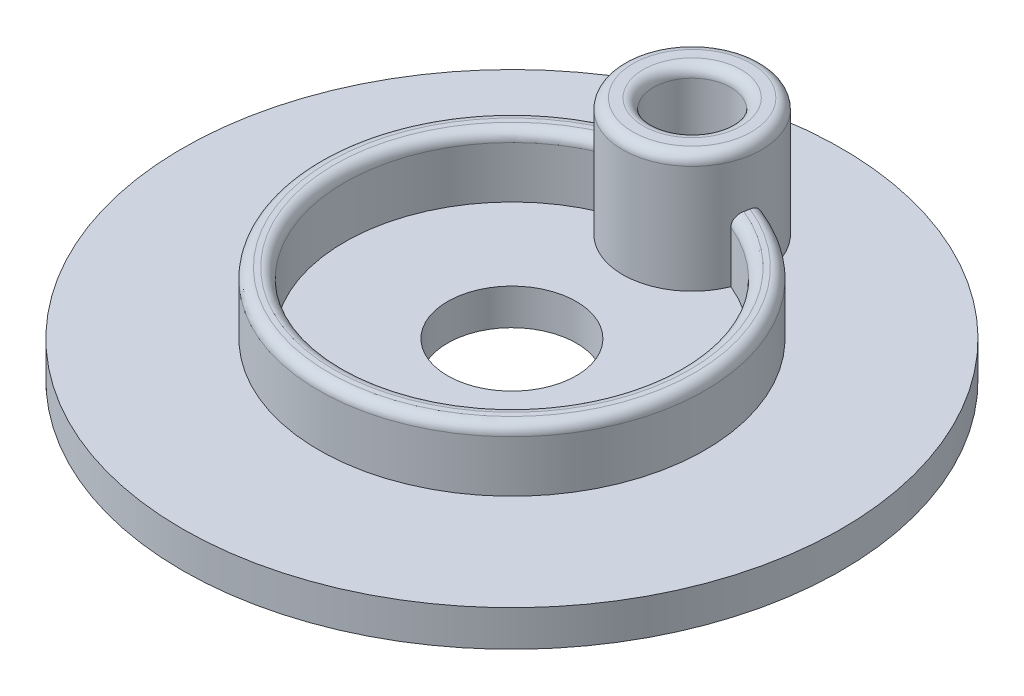
ISO-10303-21;
HEADER;
FILE_DESCRIPTION(('STEP AP214'),'2;1');
FILE_NAME('part.step','',(''),(''),'','','');
FILE_SCHEMA(('AUTOMOTIVE_DESIGN { 1 0 10303 214 1 1 1 1 }'));
ENDSEC;
DATA;
#1=APPLICATION_CONTEXT('core data for automotive mechanical design processes');
#2=APPLICATION_PROTOCOL_DEFINITION('international standard','automotive_design',2000,#1);
#3=PRODUCT_CONTEXT('',#1,'mechanical');
#4=PRODUCT('Part','Part','',(#3));
#5=PRODUCT_RELATED_PRODUCT_CATEGORY('part','',(#4));
#6=PRODUCT_DEFINITION_FORMATION('','',#4);
#7=PRODUCT_DEFINITION_CONTEXT('part definition',#1,'design');
#8=PRODUCT_DEFINITION('design','',#6,#7);
#9=PRODUCT_DEFINITION_SHAPE('','',#8);
#10=(LENGTH_UNIT() NAMED_UNIT(*) SI_UNIT(.MILLI.,.METRE.));
#11=(NAMED_UNIT(*) PLANE_ANGLE_UNIT() SI_UNIT($,.RADIAN.));
#12=(NAMED_UNIT(*) SI_UNIT($,.STERADIAN.) SOLID_ANGLE_UNIT());
#13=UNCERTAINTY_MEASURE_WITH_UNIT(LENGTH_MEASURE(1.E-05),#10,'distance_accuracy_value','');
#14=(GEOMETRIC_REPRESENTATION_CONTEXT(3) GLOBAL_UNCERTAINTY_ASSIGNED_CONTEXT((#13)) GLOBAL_UNIT_ASSIGNED_CONTEXT((#10,
#11,#12)) REPRESENTATION_CONTEXT('',''));
#15=CARTESIAN_POINT('',(0.,0.,0.));
#16=DIRECTION('',(0.,0.,1.));
#17=DIRECTION('',(1.,0.,0.));
#18=AXIS2_PLACEMENT_3D('',#15,#16,#17);
#19=CARTESIAN_POINT('',(0.,19.,0.));
#20=DIRECTION('',(0.,-1.,0.));
#21=DIRECTION('',(0.,0.,-1.));
#22=AXIS2_PLACEMENT_3D('',#19,#20,#21);
#23=CYLINDRICAL_SURFACE('',#22,32.5);
#24=CARTESIAN_POINT('',(0.,17.,0.));
#25=DIRECTION('',(0.,1.,0.));
#26=DIRECTION('',(0.,0.,1.));
#27=AXIS2_PLACEMENT_3D('',#24,#25,#26);
#28=CIRCLE('',#27,32.5);
#29=CARTESIAN_POINT('',(-12.5342306814383,17.,-29.9857142857143));
#30=VERTEX_POINT('',#29);
#31=CARTESIAN_POINT('',(12.5342306814383,17.,-29.9857142857143));
#32=VERTEX_POINT('',#31);
#33=EDGE_CURVE('E98',#30,#32,#28,.T.);
#34=ORIENTED_EDGE('',*,*,#33,.T.);
#35=DIRECTION('',(0.,-1.,0.));
#36=VECTOR('',#35,1.);
#37=CARTESIAN_POINT('',(12.5342306814383,15.,-29.9857142857143));
#38=LINE('',#37,#36);
#39=CARTESIAN_POINT('',(12.5342306814383,7.,-29.9857142857143));
#40=VERTEX_POINT('',#39);
#41=EDGE_CURVE('E200',#32,#40,#38,.T.);
#42=ORIENTED_EDGE('',*,*,#41,.T.);
#43=CARTESIAN_POINT('',(0.,7.,0.));
#44=DIRECTION('',(0.,1.,0.));
#45=DIRECTION('',(0.,0.,1.));
#46=AXIS2_PLACEMENT_3D('',#43,#44,#45);
#47=CIRCLE('',#46,32.5);
#48=CARTESIAN_POINT('',(-12.5342306814384,7.,-29.9857142857143));
#49=VERTEX_POINT('',#48);
#50=EDGE_CURVE('E105',#40,#49,#47,.F.);
#51=ORIENTED_EDGE('',*,*,#50,.T.);
#52=DIRECTION('',(0.,-1.,0.));
#53=VECTOR('',#52,1.);
#54=CARTESIAN_POINT('',(-12.5342306814383,15.,-29.9857142857143));
#55=LINE('',#54,#53);
#56=EDGE_CURVE('E91',#49,#30,#55,.F.);
#57=ORIENTED_EDGE('',*,*,#56,.T.);
#58=EDGE_LOOP('',(#34,#42,#51,#57));
#59=FACE_BOUND('',#58,.T.);
#60=ADVANCED_FACE('F39',(#59),#23,.F.);
#61=CARTESIAN_POINT('',(0.,19.,0.));
#62=DIRECTION('',(0.,-1.,0.));
#63=DIRECTION('',(0.,0.,-1.));
#64=AXIS2_PLACEMENT_3D('',#61,#62,#63);
#65=CYLINDRICAL_SURFACE('',#64,37.5);
#66=DIRECTION('',(0.,-1.,0.));
#67=VECTOR('',#66,1.);
#68=CARTESIAN_POINT('',(13.4999924414189,15.,-34.9857142857143));
#69=LINE('',#68,#67);
#70=CARTESIAN_POINT('',(13.4999924414189,17.,-34.9857142857143));
#71=VERTEX_POINT('',#70);
#72=CARTESIAN_POINT('',(13.4999924414189,7.,-34.9857142857143));
#73=VERTEX_POINT('',#72);
#74=EDGE_CURVE('E169',#71,#73,#69,.T.);
#75=ORIENTED_EDGE('',*,*,#74,.F.);
#76=CARTESIAN_POINT('',(0.,17.,0.));
#77=DIRECTION('',(0.,1.,0.));
#78=DIRECTION('',(0.,0.,1.));
#79=AXIS2_PLACEMENT_3D('',#76,#77,#78);
#80=CIRCLE('',#79,37.5);
#81=CARTESIAN_POINT('',(-13.4999924414189,17.,-34.9857142857143));
#82=VERTEX_POINT('',#81);
#83=EDGE_CURVE('E110',#71,#82,#80,.F.);
#84=ORIENTED_EDGE('',*,*,#83,.T.);
#85=DIRECTION('',(0.,-1.,0.));
#86=VECTOR('',#85,1.);
#87=CARTESIAN_POINT('',(-13.4999924414189,15.,-34.9857142857143));
#88=LINE('',#87,#86);
#89=CARTESIAN_POINT('',(-13.4999924414189,7.,-34.9857142857143));
#90=VERTEX_POINT('',#89);
#91=EDGE_CURVE('E196',#90,#82,#88,.F.);
#92=ORIENTED_EDGE('',*,*,#91,.F.);
#93=CARTESIAN_POINT('',(0.,7.,0.));
#94=DIRECTION('',(0.,1.,0.));
#95=DIRECTION('',(0.,0.,1.));
#96=AXIS2_PLACEMENT_3D('',#93,#94,#95);
#97=CIRCLE('',#96,37.5);
#98=EDGE_CURVE('E174',#90,#73,#97,.T.);
#99=ORIENTED_EDGE('',*,*,#98,.T.);
#100=EDGE_LOOP('',(#75,#84,#92,#99));
#101=FACE_BOUND('',#100,.T.);
#102=ADVANCED_FACE('F157',(#101),#65,.T.);
#103=CARTESIAN_POINT('',(0.,17.,0.));
#104=DIRECTION('',(0.,1.,0.));
#105=DIRECTION('',(0.,0.,1.));
#106=AXIS2_PLACEMENT_3D('',#103,#104,#105);
#107=TOROIDAL_SURFACE('',#106,35.5,2.);
#108=ORIENTED_EDGE('',*,*,#83,.F.);
#109=CARTESIAN_POINT('',(13.4999924414076,16.9998,-34.985714275));
#110=CARTESIAN_POINT('',(13.4999899547307,17.0536329745252,-34.9857287238921));
#111=CARTESIAN_POINT('',(13.4999899276816,17.1074619317858,-34.9833972496276));
#112=CARTESIAN_POINT('',(13.4999766332635,17.2147073111454,-34.9741090601479));
#113=CARTESIAN_POINT('',(13.4999633689337,17.2681238250999,-34.9671534067124));
#114=CARTESIAN_POINT('',(13.499905538721,17.3740132564129,-34.9487098217433));
#115=CARTESIAN_POINT('',(13.4998610624664,17.4264884354747,-34.937234909009));
#116=CARTESIAN_POINT('',(13.4997061356343,17.5302664603213,-34.909888940599));
#117=CARTESIAN_POINT('',(13.4995956834144,17.5815692768869,-34.8940177754833));
#118=CARTESIAN_POINT('',(13.4991009478815,17.7331455080814,-34.8400511133429));
#119=CARTESIAN_POINT('',(13.4985534243507,17.8312261073027,-34.7955777571894));
#120=CARTESIAN_POINT('',(13.496571460751,18.018849826176,-34.6913604325385));
#121=CARTESIAN_POINT('',(13.495136596677,18.1083888407102,-34.631609171687));
#122=CARTESIAN_POINT('',(13.4907851678145,18.2798138791902,-34.4965933977191));
#123=CARTESIAN_POINT('',(13.487820341785,18.361340728843,-34.4208742995195));
#124=CARTESIAN_POINT('',(13.4798195699396,18.5114209090165,-34.2576123285346));
#125=CARTESIAN_POINT('',(13.4747829919531,18.5799702702788,-34.1700658522452));
#126=CARTESIAN_POINT('',(13.461787763825,18.7061809248193,-33.9802904275848));
#127=CARTESIAN_POINT('',(13.4536786481031,18.7629967187266,-33.8775084744869));
#128=CARTESIAN_POINT('',(13.434191708356,18.8591602094536,-33.664356522181));
#129=CARTESIAN_POINT('',(13.4228134558381,18.8985056146712,-33.5539855297053));
#130=CARTESIAN_POINT('',(13.3963056625503,18.9593530414738,-33.3259413135855));
#131=CARTESIAN_POINT('',(13.3810921218905,18.980400937157,-33.2081560858591));
#132=CARTESIAN_POINT('',(13.347220150079,19.0021669054666,-32.971199584585));
#133=CARTESIAN_POINT('',(13.3285619207529,19.0028861687747,-32.8520283926245));
#134=CARTESIAN_POINT('',(13.2886712580937,18.9837814867689,-32.6177506991559));
#135=CARTESIAN_POINT('',(13.2674849557477,18.9642871303243,-32.5026096575149));
#136=CARTESIAN_POINT('',(13.2232074306106,18.9054833668645,-32.2778868322746));
#137=CARTESIAN_POINT('',(13.2001165658804,18.8661776773439,-32.1683040099483));
#138=CARTESIAN_POINT('',(13.1539706322896,18.7701503779794,-31.9612532947442));
#139=CARTESIAN_POINT('',(13.1309357892816,18.7139941660639,-31.8635184821903));
#140=CARTESIAN_POINT('',(13.0855537030355,18.5853813846498,-31.6792624018784));
#141=CARTESIAN_POINT('',(13.0632063616116,18.5129271551624,-31.5927395271582));
#142=CARTESIAN_POINT('',(13.021011075757,18.3553202712599,-31.4349149209358));
#143=CARTESIAN_POINT('',(13.001123090462,18.2704408857248,-31.3633507303774));
#144=CARTESIAN_POINT('',(12.9646110233555,18.0893501575886,-31.2352539998953));
#145=CARTESIAN_POINT('',(12.9479876844063,17.993136243793,-31.1787248801307));
#146=CARTESIAN_POINT('',(12.9191651259513,17.7926024562649,-31.0823859589683));
#147=CARTESIAN_POINT('',(12.9069472904254,17.688319007875,-31.0425056901417));
#148=CARTESIAN_POINT('',(12.8876599780105,17.4742977638884,-30.9801366129713));
#149=CARTESIAN_POINT('',(12.8805838414646,17.3645672211266,-30.9576253055681));
#150=CARTESIAN_POINT('',(12.8746783416316,17.2116227676772,-30.9388825083058));
#151=CARTESIAN_POINT('',(12.8734558295233,17.1693203162385,-30.9350102083425));
#152=CARTESIAN_POINT('',(12.871827208792,17.0846180119705,-30.9298560310052));
#153=CARTESIAN_POINT('',(12.8714196463463,17.0422184679216,-30.9285695406765));
#154=CARTESIAN_POINT('',(12.8714206467543,16.9998,-30.9285714381429));
#155=B_SPLINE_CURVE_WITH_KNOTS('',3,(#109,#110,#111,#112,#113,#114,#115,#116,#117,#118,#119,
#120,#121,#122,#123,#124,#125,#126,#127,#128,#129,#130,#131,#132,#133,#134,#135,#136,#137,#138,
#139,#140,#141,#142,#143,#144,#145,#146,#147,#148,#149,#150,#151,#152,#153,#154),.UNSPECIFIED.,
.F.,.F.,(4,2,2,2,2,2,2,2,2,2,2,2,2,2,2,2,2,2,2,2,2,2,4),(0.,0.161440946562061,0.322844836699355,
0.4837871262088,0.644733422571578,0.966206653779078,1.28783361596148,1.62028953473868,
1.95284697385498,2.30439862484178,2.65599637547557,3.01608986065854,3.37616225452467,
3.73045450987586,4.08468030884758,4.4281442754682,4.77155896019543,5.10831913809362,
5.44515585638527,5.78055206976081,6.11551309145407,6.24293635038863,6.37013209013873),.UNSPECIFIED.);
#156=CARTESIAN_POINT('',(13.3356664625357,19.,-32.9));
#157=VERTEX_POINT('',#156);
#158=EDGE_CURVE('E61',#71,#157,#155,.T.);
#159=ORIENTED_EDGE('',*,*,#158,.T.);
#160=CARTESIAN_POINT('',(0.,19.,0.));
#161=DIRECTION('',(0.,1.,0.));
#162=DIRECTION('',(0.,0.,1.));
#163=AXIS2_PLACEMENT_3D('',#160,#161,#162);
#164=CIRCLE('',#163,35.5);
#165=CARTESIAN_POINT('',(-13.3356664625357,19.,-32.9));
#166=VERTEX_POINT('',#165);
#167=EDGE_CURVE('E113',#166,#157,#164,.T.);
#168=ORIENTED_EDGE('',*,*,#167,.F.);
#169=CARTESIAN_POINT('',(-12.8714206467543,16.9998,-30.9285714381429));
#170=CARTESIAN_POINT('',(-12.8714171743057,17.0558214967457,-30.9285671117731));
#171=CARTESIAN_POINT('',(-12.8721305543787,17.1118164220704,-30.9308149912982));
#172=CARTESIAN_POINT('',(-12.8749675988924,17.2234066950352,-30.939797781384));
#173=CARTESIAN_POINT('',(-12.8770912019435,17.2790020599623,-30.9465324966247));
#174=CARTESIAN_POINT('',(-12.8855335680313,17.4445051202344,-30.9734132797008));
#175=CARTESIAN_POINT('',(-12.8939240290957,17.5533057994145,-31.000236100277));
#176=CARTESIAN_POINT('',(-12.915676852192,17.7646422109985,-31.0710501117122));
#177=CARTESIAN_POINT('',(-12.9290416876298,17.8671747971435,-31.1150498439719));
#178=CARTESIAN_POINT('',(-12.959854702327,18.0630504522336,-31.2191140166693));
#179=CARTESIAN_POINT('',(-12.9773019302378,18.15639565499,-31.2791747147731));
#180=CARTESIAN_POINT('',(-13.0151360624063,18.3311882433863,-31.4137624534301));
#181=CARTESIAN_POINT('',(-13.0355205469729,18.4126453122822,-31.4882776038329));
#182=CARTESIAN_POINT('',(-13.0779722963667,18.5615029336063,-31.6498355186865));
#183=CARTESIAN_POINT('',(-13.1000397844668,18.6289016165566,-31.7368799466774));
#184=CARTESIAN_POINT('',(-13.1445807006417,18.7478921928802,-31.9212042880693));
#185=CARTESIAN_POINT('',(-13.1670545135254,18.7994681707984,-32.0184943759557));
#186=CARTESIAN_POINT('',(-13.211179960333,18.885468921686,-32.2205381664594));
#187=CARTESIAN_POINT('',(-13.2328316150369,18.919894128406,-32.3252916802467));
#188=CARTESIAN_POINT('',(-13.2745470953848,18.9712112273075,-32.5406187903204));
#189=CARTESIAN_POINT('',(-13.2945898754688,18.9878976183008,-32.6512453363155));
#190=CARTESIAN_POINT('',(-13.3320530902172,19.0028958857205,-32.8741726296029));
#191=CARTESIAN_POINT('',(-13.3494731052434,19.0012048249452,-32.9864736416547));
#192=CARTESIAN_POINT('',(-13.3816651815677,18.9794955424646,-33.2127034841558));
#193=CARTESIAN_POINT('',(-13.3963558738581,18.958998131587,-33.3265978338997));
#194=CARTESIAN_POINT('',(-13.4223692004177,18.899758718818,-33.5499448835898));
#195=CARTESIAN_POINT('',(-13.4336912048825,18.8610133088033,-33.6593967496773));
#196=CARTESIAN_POINT('',(-13.4533917435719,18.7650132139934,-33.8738686714077));
#197=CARTESIAN_POINT('',(-13.4616792875389,18.7072720320959,-33.9786797210964));
#198=CARTESIAN_POINT('',(-13.475283663668,18.5750700140086,-34.1774040742907));
#199=CARTESIAN_POINT('',(-13.4806003214898,18.5006081969627,-34.2713167379911));
#200=CARTESIAN_POINT('',(-13.4888780917181,18.3367250126292,-34.4452370704666));
#201=CARTESIAN_POINT('',(-13.4918386052043,18.2472998487193,-34.5252411997241));
#202=CARTESIAN_POINT('',(-13.496116703207,18.0557244362214,-34.6683666663511));
#203=CARTESIAN_POINT('',(-13.4974342192464,17.953573657449,-34.7314872999624));
#204=CARTESIAN_POINT('',(-13.4990980244909,17.7441677065437,-34.8357875529394));
#205=CARTESIAN_POINT('',(-13.4994841426285,17.6373290739777,-34.8778035801506));
#206=CARTESIAN_POINT('',(-13.4999141032593,17.4179477808811,-34.9419348001987));
#207=CARTESIAN_POINT('',(-13.4999586782838,17.3054178493464,-34.9640924943322));
#208=CARTESIAN_POINT('',(-13.4999838832169,17.1600431580398,-34.9791222671939));
#209=CARTESIAN_POINT('',(-13.4999874462015,17.1280198678336,-34.9815978651276));
#210=CARTESIAN_POINT('',(-13.4999917604785,17.0639357203313,-34.9848931565138));
#211=CARTESIAN_POINT('',(-13.4999925159285,17.0318749889722,-34.9857152976958));
#212=CARTESIAN_POINT('',(-13.4999924414076,16.9998,-34.9857142750002));
#213=B_SPLINE_CURVE_WITH_KNOTS('',3,(#169,#170,#171,#172,#173,#174,#175,#176,#177,#178,#179,
#180,#181,#182,#183,#184,#185,#186,#187,#188,#189,#190,#191,#192,#193,#194,#195,#196,#197,#198,
#199,#200,#201,#202,#203,#204,#205,#206,#207,#208,#209,#210,#211,#212),.UNSPECIFIED.,.F.,.F.,(4,
2,2,2,2,2,2,2,2,2,2,2,2,2,2,2,2,2,2,2,2,4),(0.,0.167961358496068,0.33591540581312,
0.671302160853763,1.00685590337051,1.34233152719845,1.67753235204671,2.01277772337907,
2.34835920790121,2.68393220498634,3.02335175297076,3.36282554995191,3.71119688037144,
4.05963330086135,4.41779638691247,4.7759804888081,5.13425561028377,5.49254566348779,
5.83521929617429,6.17715776665774,6.27348617197007,6.36967187022839),.UNSPECIFIED.);
#214=EDGE_CURVE('E106',#166,#82,#213,.T.);
#215=ORIENTED_EDGE('',*,*,#214,.T.);
#216=EDGE_LOOP('',(#108,#159,#168,#215));
#217=FACE_BOUND('',#216,.T.);
#218=ADVANCED_FACE('F153',(#217),#107,.T.);
#219=CARTESIAN_POINT('',(0.,17.,0.));
#220=DIRECTION('',(0.,1.,0.));
#221=DIRECTION('',(0.,0.,1.));
#222=AXIS2_PLACEMENT_3D('',#219,#220,#221);
#223=TOROIDAL_SURFACE('',#222,34.5,2.);
#224=CARTESIAN_POINT('',(0.,19.,0.));
#225=DIRECTION('',(0.,1.,0.));
#226=DIRECTION('',(0.,0.,1.));
#227=AXIS2_PLACEMENT_3D('',#224,#225,#226);
#228=CIRCLE('',#227,34.5);
#229=CARTESIAN_POINT('',(13.1392541645258,19.0000000000022,-31.8999999999998));
#230=VERTEX_POINT('',#229);
#231=CARTESIAN_POINT('',(-13.1392541645255,19.,-31.9));
#232=VERTEX_POINT('',#231);
#233=EDGE_CURVE('E186',#230,#232,#228,.F.);
#234=ORIENTED_EDGE('',*,*,#233,.F.);
#235=CARTESIAN_POINT('',(13.4574158289762,16.9998,-33.9285714181429));
#236=CARTESIAN_POINT('',(13.4574144173344,17.0545056757267,-33.928578843322));
#237=CARTESIAN_POINT('',(13.4572304603151,17.1091844471926,-33.9262404796411));
#238=CARTESIAN_POINT('',(13.4564838598886,17.218131998119,-33.9169142550499));
#239=CARTESIAN_POINT('',(13.4559212822476,17.2724008471276,-33.909927201617));
#240=CARTESIAN_POINT('',(13.4536498283262,17.4337539396021,-33.8821122901966));
#241=CARTESIAN_POINT('',(13.4513573831885,17.5397269979853,-33.8544301241502));
#242=CARTESIAN_POINT('',(13.4449784553747,17.7454532895092,-33.7818612507831));
#243=CARTESIAN_POINT('',(13.4408922087323,17.8452073389934,-33.7369768070862));
#244=CARTESIAN_POINT('',(13.4305739973357,18.0360152113749,-33.6316159779949));
#245=CARTESIAN_POINT('',(13.4243414211031,18.1270665454586,-33.571135150505));
#246=CARTESIAN_POINT('',(13.4091580731518,18.3002378827599,-33.434986634043));
#247=CARTESIAN_POINT('',(13.4001470188815,18.3820985500734,-33.358996233747));
#248=CARTESIAN_POINT('',(13.3790574540853,18.5324223858058,-33.195106525718));
#249=CARTESIAN_POINT('',(13.3669781511551,18.6008820851978,-33.1072041443426));
#250=CARTESIAN_POINT('',(13.3389501789862,18.7249333065295,-32.9187045171992));
#251=CARTESIAN_POINT('',(13.3228792968959,18.7799813003279,-32.8177672257079));
#252=CARTESIAN_POINT('',(13.2869546411496,18.8724741931693,-32.6087507538406));
#253=CARTESIAN_POINT('',(13.2671007797468,18.9099186838267,-32.5006714078416));
#254=CARTESIAN_POINT('',(13.2235226881637,18.9663246851704,-32.27947523551));
#255=CARTESIAN_POINT('',(13.199765923008,18.9851205740949,-32.1663224372503));
#256=CARTESIAN_POINT('',(13.148955175443,19.0029067051528,-31.9391973925251));
#257=CARTESIAN_POINT('',(13.1219014478561,19.0018984769831,-31.8252252100297));
#258=CARTESIAN_POINT('',(13.0657951446087,18.9800619834496,-31.6017579153184));
#259=CARTESIAN_POINT('',(13.0367840589503,18.9595688464566,-31.4922196959342));
#260=CARTESIAN_POINT('',(12.9774833344311,18.8996437962992,-31.2788182771367));
#261=CARTESIAN_POINT('',(12.9471938470116,18.860214120672,-31.1749544088578));
#262=CARTESIAN_POINT('',(12.8872987906026,18.7643786442,-30.9778171956945));
#263=CARTESIAN_POINT('',(12.8576912505481,18.7083130983703,-30.8843788804021));
#264=CARTESIAN_POINT('',(12.8000270425148,18.5804967058315,-30.7083925629165));
#265=CARTESIAN_POINT('',(12.7719702647317,18.5087469714537,-30.6258437890961));
#266=CARTESIAN_POINT('',(12.7190529410507,18.3520954903509,-30.4742834044056));
#267=CARTESIAN_POINT('',(12.6941733633002,18.2672794943705,-30.4051897454779));
#268=CARTESIAN_POINT('',(12.6487563939327,18.0865340347076,-30.2815985996307));
#269=CARTESIAN_POINT('',(12.6282201963043,17.9906015263017,-30.2271051251847));
#270=CARTESIAN_POINT('',(12.5926014063199,17.7900514594601,-30.133903341536));
#271=CARTESIAN_POINT('',(12.5775365423574,17.6854069950348,-30.0952462951689));
#272=CARTESIAN_POINT('',(12.5538444995709,17.4707146581686,-30.0349164781093));
#273=CARTESIAN_POINT('',(12.5452089055412,17.3606740505973,-30.0132215040611));
#274=CARTESIAN_POINT('',(12.5380973871844,17.2081290268839,-29.9953891622806));
#275=CARTESIAN_POINT('',(12.5366460719681,17.1665205228256,-29.9917556546748));
#276=CARTESIAN_POINT('',(12.534713044891,17.0832139548519,-29.9869194799736));
#277=CARTESIAN_POINT('',(12.5342296203805,17.0415161800581,-29.98571251917));
#278=CARTESIAN_POINT('',(12.5342306851531,16.9998,-29.985714295));
#279=B_SPLINE_CURVE_WITH_KNOTS('',3,(#235,#236,#237,#238,#239,#240,#241,#242,#243,#244,#245,
#246,#247,#248,#249,#250,#251,#252,#253,#254,#255,#256,#257,#258,#259,#260,#261,#262,#263,#264,
#265,#266,#267,#268,#269,#270,#271,#272,#273,#274,#275,#276,#277,#278),.UNSPECIFIED.,.F.,.F.,(4,
2,2,2,2,2,2,2,2,2,2,2,2,2,2,2,2,2,2,2,2,4),(0.,0.164013114976911,0.327997748307102,
0.654953654600703,0.98186655198686,1.30887266234879,1.64354277639147,1.97829941020852,
2.32494805147729,2.67160473428877,3.02131329684437,3.37099484753967,3.71476886214648,
4.05850226648402,4.39564011551689,4.73275406229653,5.06774310429607,5.40282411493564,
5.7389813783424,6.07469787165953,6.20001093474513,6.32510206394407),.UNSPECIFIED.);
#280=EDGE_CURVE('E97',#230,#32,#279,.T.);
#281=ORIENTED_EDGE('',*,*,#280,.T.);
#282=ORIENTED_EDGE('',*,*,#33,.F.);
#283=CARTESIAN_POINT('',(-12.5342306851531,16.9998,-29.985714295));
#284=CARTESIAN_POINT('',(-12.5342268697503,17.0560370969131,-29.9857102014814));
#285=CARTESIAN_POINT('',(-12.5351083889939,17.112247504364,-29.9879076817219));
#286=CARTESIAN_POINT('',(-12.5386171632372,17.2242670653584,-29.9966898332425));
#287=CARTESIAN_POINT('',(-12.5412443393752,17.2800762369129,-30.0032743063356));
#288=CARTESIAN_POINT('',(-12.5516963952655,17.4462179749447,-30.0295577193439));
#289=CARTESIAN_POINT('',(-12.5620919513565,17.5554391168735,-30.0557867580812));
#290=CARTESIAN_POINT('',(-12.5891352216796,17.7675921308088,-30.125059934522));
#291=CARTESIAN_POINT('',(-12.6057859806872,17.8705209115369,-30.1681122615214));
#292=CARTESIAN_POINT('',(-12.6443687816386,18.0671541834741,-30.270000660939));
#293=CARTESIAN_POINT('',(-12.6662996704453,18.1608606824676,-30.3288332873889));
#294=CARTESIAN_POINT('',(-12.71417539284,18.3362806307703,-30.4607657656329));
#295=CARTESIAN_POINT('',(-12.7401156037068,18.4180076834803,-30.533849211402));
#296=CARTESIAN_POINT('',(-12.7946190182422,18.5672854145666,-30.6924783656644));
#297=CARTESIAN_POINT('',(-12.8231825229434,18.6348344630349,-30.7780255050751));
#298=CARTESIAN_POINT('',(-12.8813541023824,18.7536392468189,-30.9589970000832));
#299=CARTESIAN_POINT('',(-12.9109582246778,18.8049505009224,-31.0543861877352));
#300=CARTESIAN_POINT('',(-12.9699017117889,18.8902257582849,-31.2526892087434));
#301=CARTESIAN_POINT('',(-12.9992410969053,18.9241911029708,-31.3556024595304));
#302=CARTESIAN_POINT('',(-13.0564582511928,18.9739983135213,-31.5662246489553));
#303=CARTESIAN_POINT('',(-13.0843345102258,18.9898217924573,-31.673938338251));
#304=CARTESIAN_POINT('',(-13.1376245140699,19.003044226538,-31.8910896393815));
#305=CARTESIAN_POINT('',(-13.1630380273819,19.0004414513077,-32.0005274121589));
#306=CARTESIAN_POINT('',(-13.2110676270142,18.9769229859204,-32.219632337999));
#307=CARTESIAN_POINT('',(-13.2336403826622,18.955755665444,-32.3292819056834));
#308=CARTESIAN_POINT('',(-13.2752139476901,18.8955084731271,-32.5442532211605));
#309=CARTESIAN_POINT('',(-13.2942142818322,18.8564262204455,-32.6495743916944));
#310=CARTESIAN_POINT('',(-13.3289403736964,18.7604541276025,-32.8551346096964));
#311=CARTESIAN_POINT('',(-13.3445886847945,18.7032063677102,-32.955219782195));
#312=CARTESIAN_POINT('',(-13.3722800261321,18.5727080043764,-33.1449178755092));
#313=CARTESIAN_POINT('',(-13.3843228762751,18.4994566018528,-33.234530273063));
#314=CARTESIAN_POINT('',(-13.4052345081904,18.33832263572,-33.4010060902396));
#315=CARTESIAN_POINT('',(-13.414083447063,18.2503534113501,-33.477788269201));
#316=CARTESIAN_POINT('',(-13.4289759312037,18.0623815166404,-33.6152952852834));
#317=CARTESIAN_POINT('',(-13.4350190162139,17.962376875458,-33.6760174873054));
#318=CARTESIAN_POINT('',(-13.4446552025307,17.7557533375156,-33.7777863466095));
#319=CARTESIAN_POINT('',(-13.4483045398741,17.6493556567674,-33.819277356271));
#320=CARTESIAN_POINT('',(-13.4537482819707,17.430997184884,-33.8829946601765));
#321=CARTESIAN_POINT('',(-13.455546165058,17.3190472412716,-33.9052570665295));
#322=CARTESIAN_POINT('',(-13.456824590558,17.1718751733412,-33.9211695182661));
#323=CARTESIAN_POINT('',(-13.4570470543442,17.1374912362917,-33.9239491880648));
#324=CARTESIAN_POINT('',(-13.4573426123094,17.0686765089656,-33.9276493397925));
#325=CARTESIAN_POINT('',(-13.4574159386702,17.0342458751527,-33.9285727116391));
#326=CARTESIAN_POINT('',(-13.4574158289763,16.9998,-33.9285714181432));
#327=B_SPLINE_CURVE_WITH_KNOTS('',3,(#283,#284,#285,#286,#287,#288,#289,#290,#291,#292,#293,
#294,#295,#296,#297,#298,#299,#300,#301,#302,#303,#304,#305,#306,#307,#308,#309,#310,#311,#312,
#313,#314,#315,#316,#317,#318,#319,#320,#321,#322,#323,#324,#325,#326),.UNSPECIFIED.,.F.,.F.,(4,
2,2,2,2,2,2,2,2,2,2,2,2,2,2,2,2,2,2,2,2,4),(0.,0.168607732966097,0.337207849425625,
0.673891678436985,1.01073960408894,1.34751403154103,1.68390301780707,2.02033065430595,
2.35559525892231,2.6908339322903,3.02641207326334,3.36202172817174,3.70225190011525,
4.04252730075171,4.3899736564934,4.73743736463633,5.08702405062106,5.43666806077358,
5.77777195553727,6.11823384149522,6.221689479048,6.32498392991242),.UNSPECIFIED.);
#328=EDGE_CURVE('E88',#30,#232,#327,.T.);
#329=ORIENTED_EDGE('',*,*,#328,.T.);
#330=EDGE_LOOP('',(#234,#281,#282,#329));
#331=FACE_BOUND('',#330,.T.);
#332=ADVANCED_FACE('F109',(#331),#223,.T.);
#333=CARTESIAN_POINT('',(0.,7.,0.));
#334=DIRECTION('',(0.,-1.,0.));
#335=DIRECTION('',(0.,0.,-1.));
#336=AXIS2_PLACEMENT_3D('',#333,#334,#335);
#337=CYLINDRICAL_SURFACE('',#336,64.);
#338=CARTESIAN_POINT('',(0.,7.,0.));
#339=DIRECTION('',(0.,1.,0.));
#340=DIRECTION('',(0.,0.,1.));
#341=AXIS2_PLACEMENT_3D('',#338,#339,#340);
#342=CIRCLE('',#341,64.);
#343=CARTESIAN_POINT('',(0.,7.,64.));
#344=VERTEX_POINT('',#343);
#345=EDGE_CURVE('E180',#344,#344,#342,.T.);
#346=ORIENTED_EDGE('',*,*,#345,.F.);
#347=EDGE_LOOP('',(#346));
#348=FACE_BOUND('',#347,.T.);
#349=CARTESIAN_POINT('',(0.,0.,0.));
#350=DIRECTION('',(0.,1.,0.));
#351=DIRECTION('',(0.,0.,1.));
#352=AXIS2_PLACEMENT_3D('',#349,#350,#351);
#353=CIRCLE('',#352,64.);
#354=CARTESIAN_POINT('',(0.,0.,64.));
#355=VERTEX_POINT('',#354);
#356=EDGE_CURVE('E179',#355,#355,#353,.T.);
#357=ORIENTED_EDGE('',*,*,#356,.T.);
#358=EDGE_LOOP('',(#357));
#359=FACE_BOUND('',#358,.T.);
#360=ADVANCED_FACE('F159',(#348,#359),#337,.T.);
#361=CARTESIAN_POINT('',(0.,7.,0.));
#362=DIRECTION('',(0.,1.,0.));
#363=DIRECTION('',(0.,0.,1.));
#364=AXIS2_PLACEMENT_3D('',#361,#362,#363);
#365=PLANE('',#364);
#366=ORIENTED_EDGE('',*,*,#98,.F.);
#367=CARTESIAN_POINT('',(0.,7.,-35.));
#368=DIRECTION('',(0.,1.,0.));
#369=DIRECTION('',(0.,0.,1.));
#370=AXIS2_PLACEMENT_3D('',#367,#368,#369);
#371=CIRCLE('',#370,13.5);
#372=EDGE_CURVE('E199',#90,#73,#371,.F.);
#373=ORIENTED_EDGE('',*,*,#372,.T.);
#374=EDGE_LOOP('',(#366,#373));
#375=FACE_BOUND('',#374,.T.);
#376=ORIENTED_EDGE('',*,*,#345,.T.);
#377=EDGE_LOOP('',(#376));
#378=FACE_BOUND('',#377,.T.);
#379=ADVANCED_FACE('F227',(#375,#378),#365,.T.);
#380=CARTESIAN_POINT('',(0.,0.,0.));
#381=DIRECTION('',(0.,1.,0.));
#382=DIRECTION('',(0.,0.,1.));
#383=AXIS2_PLACEMENT_3D('',#380,#381,#382);
#384=PLANE('',#383);
#385=CARTESIAN_POINT('',(0.,0.,-35.));
#386=DIRECTION('',(0.,1.,0.));
#387=DIRECTION('',(0.,0.,1.));
#388=AXIS2_PLACEMENT_3D('',#385,#386,#387);
#389=CIRCLE('',#388,7.5);
#390=CARTESIAN_POINT('',(0.,0.,-27.5));
#391=VERTEX_POINT('',#390);
#392=EDGE_CURVE('E202',#391,#391,#389,.T.);
#393=ORIENTED_EDGE('',*,*,#392,.T.);
#394=EDGE_LOOP('',(#393));
#395=FACE_BOUND('',#394,.T.);
#396=CARTESIAN_POINT('',(0.,0.,0.));
#397=DIRECTION('',(0.,1.,0.));
#398=DIRECTION('',(0.,0.,1.));
#399=AXIS2_PLACEMENT_3D('',#396,#397,#398);
#400=CIRCLE('',#399,12.5);
#401=CARTESIAN_POINT('',(0.,0.,12.5));
#402=VERTEX_POINT('',#401);
#403=EDGE_CURVE('E171',#402,#402,#400,.T.);
#404=ORIENTED_EDGE('',*,*,#403,.T.);
#405=EDGE_LOOP('',(#404));
#406=FACE_BOUND('',#405,.T.);
#407=ORIENTED_EDGE('',*,*,#356,.F.);
#408=EDGE_LOOP('',(#407));
#409=FACE_BOUND('',#408,.T.);
#410=ADVANCED_FACE('F206',(#395,#406,#409),#384,.F.);
#411=CARTESIAN_POINT('',(0.,19.,0.));
#412=DIRECTION('',(0.,1.,0.));
#413=DIRECTION('',(0.,0.,1.));
#414=AXIS2_PLACEMENT_3D('',#411,#412,#413);
#415=PLANE('',#414);
#416=ORIENTED_EDGE('',*,*,#233,.T.);
#417=CARTESIAN_POINT('',(0.,19.,-35.));
#418=DIRECTION('',(0.,1.,0.));
#419=DIRECTION('',(0.,0.,1.));
#420=AXIS2_PLACEMENT_3D('',#417,#418,#419);
#421=CIRCLE('',#420,13.5);
#422=EDGE_CURVE('E54',#232,#166,#421,.F.);
#423=ORIENTED_EDGE('',*,*,#422,.T.);
#424=ORIENTED_EDGE('',*,*,#167,.T.);
#425=EDGE_CURVE('E192',#157,#230,#421,.F.);
#426=ORIENTED_EDGE('',*,*,#425,.T.);
#427=EDGE_LOOP('',(#416,#423,#424,#426));
#428=FACE_BOUND('',#427,.T.);
#429=ADVANCED_FACE('F191',(#428),#415,.T.);
#430=CARTESIAN_POINT('',(0.,7.,0.));
#431=DIRECTION('',(0.,1.,0.));
#432=DIRECTION('',(0.,0.,1.));
#433=AXIS2_PLACEMENT_3D('',#430,#431,#432);
#434=CIRCLE('',#433,12.5);
#435=CARTESIAN_POINT('',(0.,7.,12.5));
#436=VERTEX_POINT('',#435);
#437=EDGE_CURVE('E168',#436,#436,#434,.T.);
#438=ORIENTED_EDGE('',*,*,#437,.F.);
#439=EDGE_LOOP('',(#438));
#440=FACE_BOUND('',#439,.T.);
#441=ORIENTED_EDGE('',*,*,#50,.F.);
#442=CARTESIAN_POINT('',(0.,7.,-35.));
#443=DIRECTION('',(0.,1.,0.));
#444=DIRECTION('',(0.,0.,1.));
#445=AXIS2_PLACEMENT_3D('',#442,#443,#444);
#446=CIRCLE('',#445,13.5);
#447=EDGE_CURVE('E150',#40,#49,#446,.F.);
#448=ORIENTED_EDGE('',*,*,#447,.T.);
#449=EDGE_LOOP('',(#441,#448));
#450=FACE_BOUND('',#449,.T.);
#451=ADVANCED_FACE('F230',(#440,#450),#365,.T.);
#452=CARTESIAN_POINT('',(0.,0.,0.));
#453=DIRECTION('',(0.,1.,0.));
#454=DIRECTION('',(0.,0.,1.));
#455=AXIS2_PLACEMENT_3D('',#452,#453,#454);
#456=CYLINDRICAL_SURFACE('',#455,12.5);
#457=ORIENTED_EDGE('',*,*,#403,.F.);
#458=EDGE_LOOP('',(#457));
#459=FACE_BOUND('',#458,.T.);
#460=ORIENTED_EDGE('',*,*,#437,.T.);
#461=EDGE_LOOP('',(#460));
#462=FACE_BOUND('',#461,.T.);
#463=ADVANCED_FACE('F135',(#459,#462),#456,.F.);
#464=CARTESIAN_POINT('',(0.,30.,-35.));
#465=DIRECTION('',(0.,-1.,0.));
#466=DIRECTION('',(0.,0.,-1.));
#467=AXIS2_PLACEMENT_3D('',#464,#465,#466);
#468=CYLINDRICAL_SURFACE('',#467,13.5);
#469=CARTESIAN_POINT('',(0.,28.,-35.));
#470=DIRECTION('',(0.,1.,0.));
#471=DIRECTION('',(0.,0.,1.));
#472=AXIS2_PLACEMENT_3D('',#469,#470,#471);
#473=CIRCLE('',#472,13.5);
#474=CARTESIAN_POINT('',(0.,28.,-21.5));
#475=VERTEX_POINT('',#474);
#476=EDGE_CURVE('E47',#475,#475,#473,.F.);
#477=ORIENTED_EDGE('',*,*,#476,.T.);
#478=EDGE_LOOP('',(#477));
#479=FACE_BOUND('',#478,.T.);
#480=ORIENTED_EDGE('',*,*,#158,.F.);
#481=ORIENTED_EDGE('',*,*,#74,.T.);
#482=ORIENTED_EDGE('',*,*,#372,.F.);
#483=ORIENTED_EDGE('',*,*,#91,.T.);
#484=ORIENTED_EDGE('',*,*,#214,.F.);
#485=ORIENTED_EDGE('',*,*,#422,.F.);
#486=ORIENTED_EDGE('',*,*,#328,.F.);
#487=ORIENTED_EDGE('',*,*,#56,.F.);
#488=ORIENTED_EDGE('',*,*,#447,.F.);
#489=ORIENTED_EDGE('',*,*,#41,.F.);
#490=ORIENTED_EDGE('',*,*,#280,.F.);
#491=ORIENTED_EDGE('',*,*,#425,.F.);
#492=EDGE_LOOP('',(#480,#481,#482,#483,#484,#485,#486,#487,#488,#489,#490,#491));
#493=FACE_BOUND('',#492,.T.);
#494=ADVANCED_FACE('F90',(#479,#493),#468,.T.);
#495=CARTESIAN_POINT('',(0.,30.,-35.));
#496=DIRECTION('',(0.,1.,0.));
#497=DIRECTION('',(0.,0.,1.));
#498=AXIS2_PLACEMENT_3D('',#495,#496,#497);
#499=PLANE('',#498);
#500=CARTESIAN_POINT('',(0.,30.,-35.));
#501=DIRECTION('',(0.,1.,0.));
#502=DIRECTION('',(0.,0.,1.));
#503=AXIS2_PLACEMENT_3D('',#500,#501,#502);
#504=CIRCLE('',#503,11.5);
#505=CARTESIAN_POINT('',(0.,30.,-23.5));
#506=VERTEX_POINT('',#505);
#507=EDGE_CURVE('E249',#506,#506,#504,.T.);
#508=ORIENTED_EDGE('',*,*,#507,.T.);
#509=EDGE_LOOP('',(#508));
#510=FACE_BOUND('',#509,.T.);
#511=CARTESIAN_POINT('',(0.,30.,-35.));
#512=DIRECTION('',(0.,1.,0.));
#513=DIRECTION('',(0.,0.,1.));
#514=AXIS2_PLACEMENT_3D('',#511,#512,#513);
#515=CIRCLE('',#514,9.5);
#516=CARTESIAN_POINT('',(0.,30.,-25.5));
#517=VERTEX_POINT('',#516);
#518=EDGE_CURVE('E247',#517,#517,#515,.F.);
#519=ORIENTED_EDGE('',*,*,#518,.T.);
#520=EDGE_LOOP('',(#519));
#521=FACE_BOUND('',#520,.T.);
#522=ADVANCED_FACE('F134',(#510,#521),#499,.T.);
#523=CARTESIAN_POINT('',(0.,0.,-35.));
#524=DIRECTION('',(0.,1.,0.));
#525=DIRECTION('',(0.,0.,1.));
#526=AXIS2_PLACEMENT_3D('',#523,#524,#525);
#527=CYLINDRICAL_SURFACE('',#526,7.5);
#528=CARTESIAN_POINT('',(0.,28.,-35.));
#529=DIRECTION('',(0.,1.,0.));
#530=DIRECTION('',(0.,0.,1.));
#531=AXIS2_PLACEMENT_3D('',#528,#529,#530);
#532=CIRCLE('',#531,7.5);
#533=CARTESIAN_POINT('',(0.,28.,-27.5));
#534=VERTEX_POINT('',#533);
#535=EDGE_CURVE('E11',#534,#534,#532,.T.);
#536=ORIENTED_EDGE('',*,*,#535,.T.);
#537=EDGE_LOOP('',(#536));
#538=FACE_BOUND('',#537,.T.);
#539=ORIENTED_EDGE('',*,*,#392,.F.);
#540=EDGE_LOOP('',(#539));
#541=FACE_BOUND('',#540,.T.);
#542=ADVANCED_FACE('F209',(#538,#541),#527,.F.);
#543=CARTESIAN_POINT('',(0.,28.,-35.));
#544=DIRECTION('',(0.,1.,0.));
#545=DIRECTION('',(0.,0.,1.));
#546=AXIS2_PLACEMENT_3D('',#543,#544,#545);
#547=TOROIDAL_SURFACE('',#546,11.5,2.);
#548=ORIENTED_EDGE('',*,*,#476,.F.);
#549=EDGE_LOOP('',(#548));
#550=FACE_BOUND('',#549,.T.);
#551=ORIENTED_EDGE('',*,*,#507,.F.);
#552=EDGE_LOOP('',(#551));
#553=FACE_BOUND('',#552,.T.);
#554=ADVANCED_FACE('F211',(#550,#553),#547,.T.);
#555=CARTESIAN_POINT('',(0.,28.,-35.));
#556=DIRECTION('',(0.,1.,0.));
#557=DIRECTION('',(0.,0.,1.));
#558=AXIS2_PLACEMENT_3D('',#555,#556,#557);
#559=TOROIDAL_SURFACE('',#558,9.5,2.);
#560=ORIENTED_EDGE('',*,*,#518,.F.);
#561=EDGE_LOOP('',(#560));
#562=FACE_BOUND('',#561,.T.);
#563=ORIENTED_EDGE('',*,*,#535,.F.);
#564=EDGE_LOOP('',(#563));
#565=FACE_BOUND('',#564,.T.);
#566=ADVANCED_FACE('F41',(#562,#565),#559,.T.);
#567=CLOSED_SHELL('',(#60,#102,#218,#332,#360,#379,#410,#429,#451,#463,#494,#522,#542,#554,#566));
#568=MANIFOLD_SOLID_BREP('B2',#567);
#569=ADVANCED_BREP_SHAPE_REPRESENTATION('',(#18,#568),#14);
#570=SHAPE_DEFINITION_REPRESENTATION(#9,#569);
ENDSEC;
END-ISO-10303-21;
